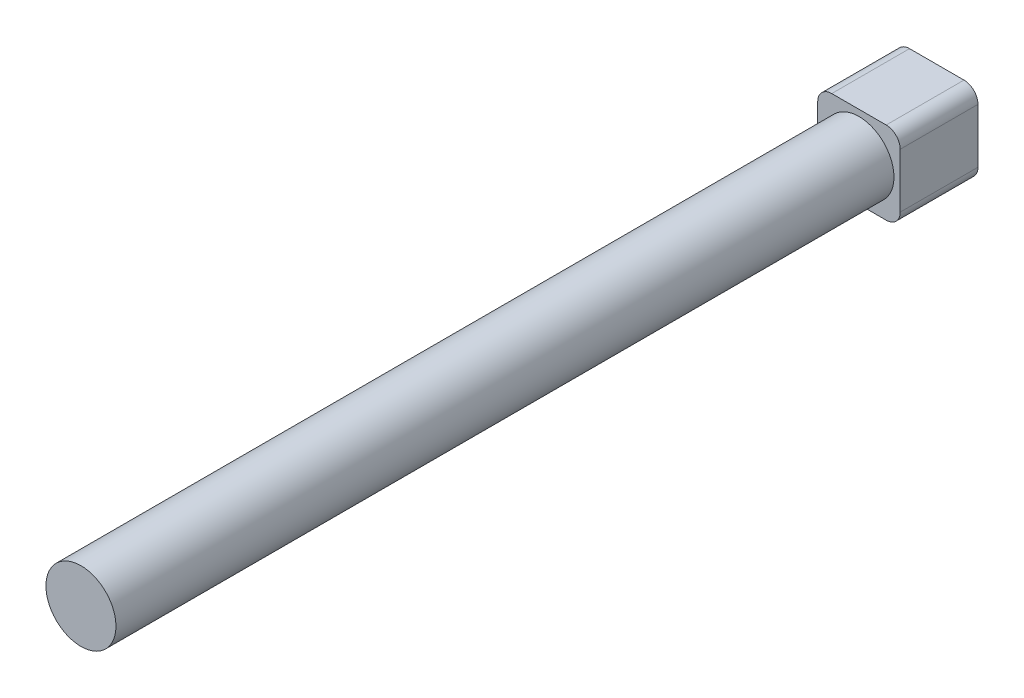
ISO-10303-21;
HEADER;
FILE_DESCRIPTION(('STEP AP214'),'2;1');
FILE_NAME('part.step','',(''),(''),'','','');
FILE_SCHEMA(('AUTOMOTIVE_DESIGN { 1 0 10303 214 1 1 1 1 }'));
ENDSEC;
DATA;
#1=APPLICATION_CONTEXT('core data for automotive mechanical design processes');
#2=APPLICATION_PROTOCOL_DEFINITION('international standard','automotive_design',2000,#1);
#3=PRODUCT_CONTEXT('',#1,'mechanical');
#4=PRODUCT('Part','Part','',(#3));
#5=PRODUCT_RELATED_PRODUCT_CATEGORY('part','',(#4));
#6=PRODUCT_DEFINITION_FORMATION('','',#4);
#7=PRODUCT_DEFINITION_CONTEXT('part definition',#1,'design');
#8=PRODUCT_DEFINITION('design','',#6,#7);
#9=PRODUCT_DEFINITION_SHAPE('','',#8);
#10=(LENGTH_UNIT() NAMED_UNIT(*) SI_UNIT(.MILLI.,.METRE.));
#11=(NAMED_UNIT(*) PLANE_ANGLE_UNIT() SI_UNIT($,.RADIAN.));
#12=(NAMED_UNIT(*) SI_UNIT($,.STERADIAN.) SOLID_ANGLE_UNIT());
#13=UNCERTAINTY_MEASURE_WITH_UNIT(LENGTH_MEASURE(1.E-05),#10,'distance_accuracy_value','');
#14=(GEOMETRIC_REPRESENTATION_CONTEXT(3) GLOBAL_UNCERTAINTY_ASSIGNED_CONTEXT((#13)) GLOBAL_UNIT_ASSIGNED_CONTEXT((#10,
#11,#12)) REPRESENTATION_CONTEXT('',''));
#15=CARTESIAN_POINT('',(0.,0.,0.));
#16=DIRECTION('',(0.,0.,1.));
#17=DIRECTION('',(1.,0.,0.));
#18=AXIS2_PLACEMENT_3D('',#15,#16,#17);
#19=CARTESIAN_POINT('',(8.8,-1.8,10.));
#20=DIRECTION('',(0.,0.,-1.));
#21=DIRECTION('',(-1.,0.,0.));
#22=AXIS2_PLACEMENT_3D('',#19,#20,#21);
#23=CYLINDRICAL_SURFACE('',#22,1.8);
#24=CARTESIAN_POINT('',(8.8,-1.8,0.));
#25=DIRECTION('',(0.,0.,1.));
#26=DIRECTION('',(1.,0.,0.));
#27=AXIS2_PLACEMENT_3D('',#24,#25,#26);
#28=CIRCLE('',#27,1.8);
#29=CARTESIAN_POINT('',(10.6,-1.80000000000001,0.));
#30=VERTEX_POINT('',#29);
#31=CARTESIAN_POINT('',(8.79999999999999,0.,0.));
#32=VERTEX_POINT('',#31);
#33=EDGE_CURVE('E131',#30,#32,#28,.T.);
#34=ORIENTED_EDGE('',*,*,#33,.T.);
#35=DIRECTION('',(0.,0.,-1.));
#36=VECTOR('',#35,1.);
#37=CARTESIAN_POINT('',(8.79999999999999,0.,10.));
#38=LINE('',#37,#36);
#39=CARTESIAN_POINT('',(8.79999999999999,0.,10.));
#40=VERTEX_POINT('',#39);
#41=EDGE_CURVE('E36',#40,#32,#38,.T.);
#42=ORIENTED_EDGE('',*,*,#41,.F.);
#43=CARTESIAN_POINT('',(8.8,-1.8,10.));
#44=DIRECTION('',(0.,0.,1.));
#45=DIRECTION('',(1.,0.,0.));
#46=AXIS2_PLACEMENT_3D('',#43,#44,#45);
#47=CIRCLE('',#46,1.8);
#48=CARTESIAN_POINT('',(10.6,-1.80000000000001,10.));
#49=VERTEX_POINT('',#48);
#50=EDGE_CURVE('E146',#49,#40,#47,.T.);
#51=ORIENTED_EDGE('',*,*,#50,.F.);
#52=DIRECTION('',(0.,0.,-1.));
#53=VECTOR('',#52,1.);
#54=CARTESIAN_POINT('',(10.6,-1.80000000000001,10.));
#55=LINE('',#54,#53);
#56=EDGE_CURVE('E127',#49,#30,#55,.T.);
#57=ORIENTED_EDGE('',*,*,#56,.T.);
#58=EDGE_LOOP('',(#34,#42,#51,#57));
#59=FACE_BOUND('',#58,.T.);
#60=ADVANCED_FACE('F33',(#59),#23,.T.);
#61=CARTESIAN_POINT('',(8.79999999999999,0.,10.));
#62=DIRECTION('',(0.,-1.,0.));
#63=DIRECTION('',(1.,0.,0.));
#64=AXIS2_PLACEMENT_3D('',#61,#62,#63);
#65=PLANE('',#64);
#66=DIRECTION('',(-1.,0.,0.));
#67=VECTOR('',#66,1.);
#68=CARTESIAN_POINT('',(8.79999999999999,0.,0.));
#69=LINE('',#68,#67);
#70=CARTESIAN_POINT('',(1.80000000000001,0.,0.));
#71=VERTEX_POINT('',#70);
#72=EDGE_CURVE('E134',#32,#71,#69,.T.);
#73=ORIENTED_EDGE('',*,*,#72,.T.);
#74=DIRECTION('',(0.,0.,-1.));
#75=VECTOR('',#74,1.);
#76=CARTESIAN_POINT('',(1.80000000000001,0.,10.));
#77=LINE('',#76,#75);
#78=CARTESIAN_POINT('',(1.80000000000001,0.,10.));
#79=VERTEX_POINT('',#78);
#80=EDGE_CURVE('E155',#79,#71,#77,.T.);
#81=ORIENTED_EDGE('',*,*,#80,.F.);
#82=DIRECTION('',(-1.,0.,0.));
#83=VECTOR('',#82,1.);
#84=CARTESIAN_POINT('',(8.79999999999999,0.,10.));
#85=LINE('',#84,#83);
#86=EDGE_CURVE('E94',#40,#79,#85,.T.);
#87=ORIENTED_EDGE('',*,*,#86,.F.);
#88=ORIENTED_EDGE('',*,*,#41,.T.);
#89=EDGE_LOOP('',(#73,#81,#87,#88));
#90=FACE_BOUND('',#89,.T.);
#91=ADVANCED_FACE('F161',(#90),#65,.F.);
#92=CARTESIAN_POINT('',(1.8,-1.8,10.));
#93=DIRECTION('',(0.,0.,-1.));
#94=DIRECTION('',(-1.,0.,0.));
#95=AXIS2_PLACEMENT_3D('',#92,#93,#94);
#96=CYLINDRICAL_SURFACE('',#95,1.8);
#97=CARTESIAN_POINT('',(1.8,-1.8,0.));
#98=DIRECTION('',(0.,0.,1.));
#99=DIRECTION('',(-1.,0.,0.));
#100=AXIS2_PLACEMENT_3D('',#97,#98,#99);
#101=CIRCLE('',#100,1.8);
#102=CARTESIAN_POINT('',(0.,-1.80000000000001,0.));
#103=VERTEX_POINT('',#102);
#104=EDGE_CURVE('E137',#71,#103,#101,.T.);
#105=ORIENTED_EDGE('',*,*,#104,.T.);
#106=DIRECTION('',(0.,0.,-1.));
#107=VECTOR('',#106,1.);
#108=CARTESIAN_POINT('',(0.,-1.80000000000001,10.));
#109=LINE('',#108,#107);
#110=CARTESIAN_POINT('',(0.,-1.80000000000001,10.));
#111=VERTEX_POINT('',#110);
#112=EDGE_CURVE('E153',#111,#103,#109,.T.);
#113=ORIENTED_EDGE('',*,*,#112,.F.);
#114=CARTESIAN_POINT('',(1.8,-1.8,10.));
#115=DIRECTION('',(0.,0.,1.));
#116=DIRECTION('',(-1.,0.,0.));
#117=AXIS2_PLACEMENT_3D('',#114,#115,#116);
#118=CIRCLE('',#117,1.8);
#119=EDGE_CURVE('E176',#79,#111,#118,.T.);
#120=ORIENTED_EDGE('',*,*,#119,.F.);
#121=ORIENTED_EDGE('',*,*,#80,.T.);
#122=EDGE_LOOP('',(#105,#113,#120,#121));
#123=FACE_BOUND('',#122,.T.);
#124=ADVANCED_FACE('F170',(#123),#96,.T.);
#125=CARTESIAN_POINT('',(0.,-1.80000000000001,10.));
#126=DIRECTION('',(1.,0.,0.));
#127=DIRECTION('',(0.,0.,-1.));
#128=AXIS2_PLACEMENT_3D('',#125,#126,#127);
#129=PLANE('',#128);
#130=DIRECTION('',(0.,-1.,0.));
#131=VECTOR('',#130,1.);
#132=CARTESIAN_POINT('',(0.,-1.80000000000001,0.));
#133=LINE('',#132,#131);
#134=CARTESIAN_POINT('',(0.,-8.8,0.));
#135=VERTEX_POINT('',#134);
#136=EDGE_CURVE('E139',#103,#135,#133,.T.);
#137=ORIENTED_EDGE('',*,*,#136,.T.);
#138=DIRECTION('',(0.,0.,-1.));
#139=VECTOR('',#138,1.);
#140=CARTESIAN_POINT('',(0.,-8.8,10.));
#141=LINE('',#140,#139);
#142=CARTESIAN_POINT('',(0.,-8.8,10.));
#143=VERTEX_POINT('',#142);
#144=EDGE_CURVE('E150',#143,#135,#141,.T.);
#145=ORIENTED_EDGE('',*,*,#144,.F.);
#146=DIRECTION('',(0.,-1.,0.));
#147=VECTOR('',#146,1.);
#148=CARTESIAN_POINT('',(0.,-1.80000000000001,10.));
#149=LINE('',#148,#147);
#150=EDGE_CURVE('E175',#111,#143,#149,.T.);
#151=ORIENTED_EDGE('',*,*,#150,.F.);
#152=ORIENTED_EDGE('',*,*,#112,.T.);
#153=EDGE_LOOP('',(#137,#145,#151,#152));
#154=FACE_BOUND('',#153,.T.);
#155=ADVANCED_FACE('F173',(#154),#129,.F.);
#156=CARTESIAN_POINT('',(1.8,-8.8,10.));
#157=DIRECTION('',(0.,0.,-1.));
#158=DIRECTION('',(-1.,0.,0.));
#159=AXIS2_PLACEMENT_3D('',#156,#157,#158);
#160=CYLINDRICAL_SURFACE('',#159,1.8);
#161=CARTESIAN_POINT('',(1.8,-8.8,0.));
#162=DIRECTION('',(0.,0.,1.));
#163=DIRECTION('',(-1.,0.,0.));
#164=AXIS2_PLACEMENT_3D('',#161,#162,#163);
#165=CIRCLE('',#164,1.8);
#166=CARTESIAN_POINT('',(1.80000000000001,-10.6,0.));
#167=VERTEX_POINT('',#166);
#168=EDGE_CURVE('E141',#135,#167,#165,.T.);
#169=ORIENTED_EDGE('',*,*,#168,.T.);
#170=DIRECTION('',(0.,0.,-1.));
#171=VECTOR('',#170,1.);
#172=CARTESIAN_POINT('',(1.80000000000001,-10.6,10.));
#173=LINE('',#172,#171);
#174=CARTESIAN_POINT('',(1.80000000000001,-10.6,10.));
#175=VERTEX_POINT('',#174);
#176=EDGE_CURVE('E122',#175,#167,#173,.T.);
#177=ORIENTED_EDGE('',*,*,#176,.F.);
#178=CARTESIAN_POINT('',(1.8,-8.8,10.));
#179=DIRECTION('',(0.,0.,1.));
#180=DIRECTION('',(-1.,0.,0.));
#181=AXIS2_PLACEMENT_3D('',#178,#179,#180);
#182=CIRCLE('',#181,1.8);
#183=EDGE_CURVE('E113',#143,#175,#182,.T.);
#184=ORIENTED_EDGE('',*,*,#183,.F.);
#185=ORIENTED_EDGE('',*,*,#144,.T.);
#186=EDGE_LOOP('',(#169,#177,#184,#185));
#187=FACE_BOUND('',#186,.T.);
#188=ADVANCED_FACE('F213',(#187),#160,.T.);
#189=CARTESIAN_POINT('',(1.80000000000001,-10.6,10.));
#190=DIRECTION('',(0.,1.,0.));
#191=DIRECTION('',(0.,0.,1.));
#192=AXIS2_PLACEMENT_3D('',#189,#190,#191);
#193=PLANE('',#192);
#194=DIRECTION('',(1.,0.,0.));
#195=VECTOR('',#194,1.);
#196=CARTESIAN_POINT('',(1.80000000000001,-10.6,0.));
#197=LINE('',#196,#195);
#198=CARTESIAN_POINT('',(8.79999999999999,-10.6,0.));
#199=VERTEX_POINT('',#198);
#200=EDGE_CURVE('E121',#167,#199,#197,.T.);
#201=ORIENTED_EDGE('',*,*,#200,.T.);
#202=DIRECTION('',(0.,0.,-1.));
#203=VECTOR('',#202,1.);
#204=CARTESIAN_POINT('',(8.79999999999999,-10.6,10.));
#205=LINE('',#204,#203);
#206=CARTESIAN_POINT('',(8.79999999999999,-10.6,10.));
#207=VERTEX_POINT('',#206);
#208=EDGE_CURVE('E118',#207,#199,#205,.T.);
#209=ORIENTED_EDGE('',*,*,#208,.F.);
#210=DIRECTION('',(1.,0.,0.));
#211=VECTOR('',#210,1.);
#212=CARTESIAN_POINT('',(1.80000000000001,-10.6,10.));
#213=LINE('',#212,#211);
#214=EDGE_CURVE('E107',#175,#207,#213,.T.);
#215=ORIENTED_EDGE('',*,*,#214,.F.);
#216=ORIENTED_EDGE('',*,*,#176,.T.);
#217=EDGE_LOOP('',(#201,#209,#215,#216));
#218=FACE_BOUND('',#217,.T.);
#219=ADVANCED_FACE('F119',(#218),#193,.F.);
#220=CARTESIAN_POINT('',(8.8,-8.8,10.));
#221=DIRECTION('',(0.,0.,-1.));
#222=DIRECTION('',(-1.,0.,0.));
#223=AXIS2_PLACEMENT_3D('',#220,#221,#222);
#224=CYLINDRICAL_SURFACE('',#223,1.8);
#225=CARTESIAN_POINT('',(8.8,-8.8,0.));
#226=DIRECTION('',(0.,0.,1.));
#227=DIRECTION('',(-1.,0.,0.));
#228=AXIS2_PLACEMENT_3D('',#225,#226,#227);
#229=CIRCLE('',#228,1.8);
#230=CARTESIAN_POINT('',(10.6,-8.79999999999999,0.));
#231=VERTEX_POINT('',#230);
#232=EDGE_CURVE('E79',#199,#231,#229,.T.);
#233=ORIENTED_EDGE('',*,*,#232,.T.);
#234=DIRECTION('',(0.,0.,-1.));
#235=VECTOR('',#234,1.);
#236=CARTESIAN_POINT('',(10.6,-8.79999999999999,10.));
#237=LINE('',#236,#235);
#238=CARTESIAN_POINT('',(10.6,-8.79999999999999,10.));
#239=VERTEX_POINT('',#238);
#240=EDGE_CURVE('E123',#239,#231,#237,.T.);
#241=ORIENTED_EDGE('',*,*,#240,.F.);
#242=CARTESIAN_POINT('',(8.8,-8.8,10.));
#243=DIRECTION('',(0.,0.,1.));
#244=DIRECTION('',(-1.,0.,0.));
#245=AXIS2_PLACEMENT_3D('',#242,#243,#244);
#246=CIRCLE('',#245,1.8);
#247=EDGE_CURVE('E111',#207,#239,#246,.T.);
#248=ORIENTED_EDGE('',*,*,#247,.F.);
#249=ORIENTED_EDGE('',*,*,#208,.T.);
#250=EDGE_LOOP('',(#233,#241,#248,#249));
#251=FACE_BOUND('',#250,.T.);
#252=ADVANCED_FACE('F125',(#251),#224,.T.);
#253=CARTESIAN_POINT('',(10.6,-8.79999999999999,10.));
#254=DIRECTION('',(-1.,0.,0.));
#255=DIRECTION('',(0.,0.,1.));
#256=AXIS2_PLACEMENT_3D('',#253,#254,#255);
#257=PLANE('',#256);
#258=DIRECTION('',(0.,1.,0.));
#259=VECTOR('',#258,1.);
#260=CARTESIAN_POINT('',(10.6,-8.79999999999999,0.));
#261=LINE('',#260,#259);
#262=EDGE_CURVE('E85',#231,#30,#261,.T.);
#263=ORIENTED_EDGE('',*,*,#262,.T.);
#264=ORIENTED_EDGE('',*,*,#56,.F.);
#265=DIRECTION('',(0.,1.,0.));
#266=VECTOR('',#265,1.);
#267=CARTESIAN_POINT('',(10.6,-8.79999999999999,10.));
#268=LINE('',#267,#266);
#269=EDGE_CURVE('E50',#239,#49,#268,.T.);
#270=ORIENTED_EDGE('',*,*,#269,.F.);
#271=ORIENTED_EDGE('',*,*,#240,.T.);
#272=EDGE_LOOP('',(#263,#264,#270,#271));
#273=FACE_BOUND('',#272,.T.);
#274=ADVANCED_FACE('F194',(#273),#257,.F.);
#275=CARTESIAN_POINT('',(8.8,-1.8,10.));
#276=DIRECTION('',(0.,0.,1.));
#277=DIRECTION('',(1.,0.,0.));
#278=AXIS2_PLACEMENT_3D('',#275,#276,#277);
#279=PLANE('',#278);
#280=CARTESIAN_POINT('',(5.3,-5.30000000000001,10.));
#281=DIRECTION('',(0.,0.,1.));
#282=DIRECTION('',(1.,0.,0.));
#283=AXIS2_PLACEMENT_3D('',#280,#281,#282);
#284=CIRCLE('',#283,4.5);
#285=CARTESIAN_POINT('',(9.8,-5.30000000000001,10.));
#286=VERTEX_POINT('',#285);
#287=EDGE_CURVE('E11',#286,#286,#284,.T.);
#288=ORIENTED_EDGE('',*,*,#287,.F.);
#289=EDGE_LOOP('',(#288));
#290=FACE_BOUND('',#289,.T.);
#291=ORIENTED_EDGE('',*,*,#50,.T.);
#292=ORIENTED_EDGE('',*,*,#86,.T.);
#293=ORIENTED_EDGE('',*,*,#119,.T.);
#294=ORIENTED_EDGE('',*,*,#150,.T.);
#295=ORIENTED_EDGE('',*,*,#183,.T.);
#296=ORIENTED_EDGE('',*,*,#214,.T.);
#297=ORIENTED_EDGE('',*,*,#247,.T.);
#298=ORIENTED_EDGE('',*,*,#269,.T.);
#299=EDGE_LOOP('',(#291,#292,#293,#294,#295,#296,#297,#298));
#300=FACE_BOUND('',#299,.T.);
#301=ADVANCED_FACE('F109',(#290,#300),#279,.T.);
#302=CARTESIAN_POINT('',(8.8,-1.8,0.));
#303=DIRECTION('',(0.,0.,1.));
#304=DIRECTION('',(1.,0.,0.));
#305=AXIS2_PLACEMENT_3D('',#302,#303,#304);
#306=PLANE('',#305);
#307=ORIENTED_EDGE('',*,*,#33,.F.);
#308=ORIENTED_EDGE('',*,*,#262,.F.);
#309=ORIENTED_EDGE('',*,*,#232,.F.);
#310=ORIENTED_EDGE('',*,*,#200,.F.);
#311=ORIENTED_EDGE('',*,*,#168,.F.);
#312=ORIENTED_EDGE('',*,*,#136,.F.);
#313=ORIENTED_EDGE('',*,*,#104,.F.);
#314=ORIENTED_EDGE('',*,*,#72,.F.);
#315=EDGE_LOOP('',(#307,#308,#309,#310,#311,#312,#313,#314));
#316=FACE_BOUND('',#315,.T.);
#317=ADVANCED_FACE('F166',(#316),#306,.F.);
#318=CARTESIAN_POINT('',(5.3,-5.30000000000001,110.));
#319=DIRECTION('',(0.,0.,-1.));
#320=DIRECTION('',(-1.,0.,0.));
#321=AXIS2_PLACEMENT_3D('',#318,#319,#320);
#322=CYLINDRICAL_SURFACE('',#321,4.5);
#323=CARTESIAN_POINT('',(5.3,-5.30000000000001,110.));
#324=DIRECTION('',(0.,0.,1.));
#325=DIRECTION('',(1.,0.,0.));
#326=AXIS2_PLACEMENT_3D('',#323,#324,#325);
#327=CIRCLE('',#326,4.5);
#328=CARTESIAN_POINT('',(9.8,-5.30000000000001,110.));
#329=VERTEX_POINT('',#328);
#330=EDGE_CURVE('E135',#329,#329,#327,.T.);
#331=ORIENTED_EDGE('',*,*,#330,.F.);
#332=EDGE_LOOP('',(#331));
#333=FACE_BOUND('',#332,.T.);
#334=ORIENTED_EDGE('',*,*,#287,.T.);
#335=EDGE_LOOP('',(#334));
#336=FACE_BOUND('',#335,.T.);
#337=ADVANCED_FACE('F187',(#333,#336),#322,.T.);
#338=CARTESIAN_POINT('',(5.3,-5.30000000000001,110.));
#339=DIRECTION('',(0.,0.,1.));
#340=DIRECTION('',(1.,0.,0.));
#341=AXIS2_PLACEMENT_3D('',#338,#339,#340);
#342=PLANE('',#341);
#343=ORIENTED_EDGE('',*,*,#330,.T.);
#344=EDGE_LOOP('',(#343));
#345=FACE_BOUND('',#344,.T.);
#346=ADVANCED_FACE('F185',(#345),#342,.T.);
#347=CLOSED_SHELL('',(#60,#91,#124,#155,#188,#219,#252,#274,#301,#317,#337,#346));
#348=MANIFOLD_SOLID_BREP('B2',#347);
#349=ADVANCED_BREP_SHAPE_REPRESENTATION('',(#18,#348),#14);
#350=SHAPE_DEFINITION_REPRESENTATION(#9,#349);
ENDSEC;
END-ISO-10303-21;
